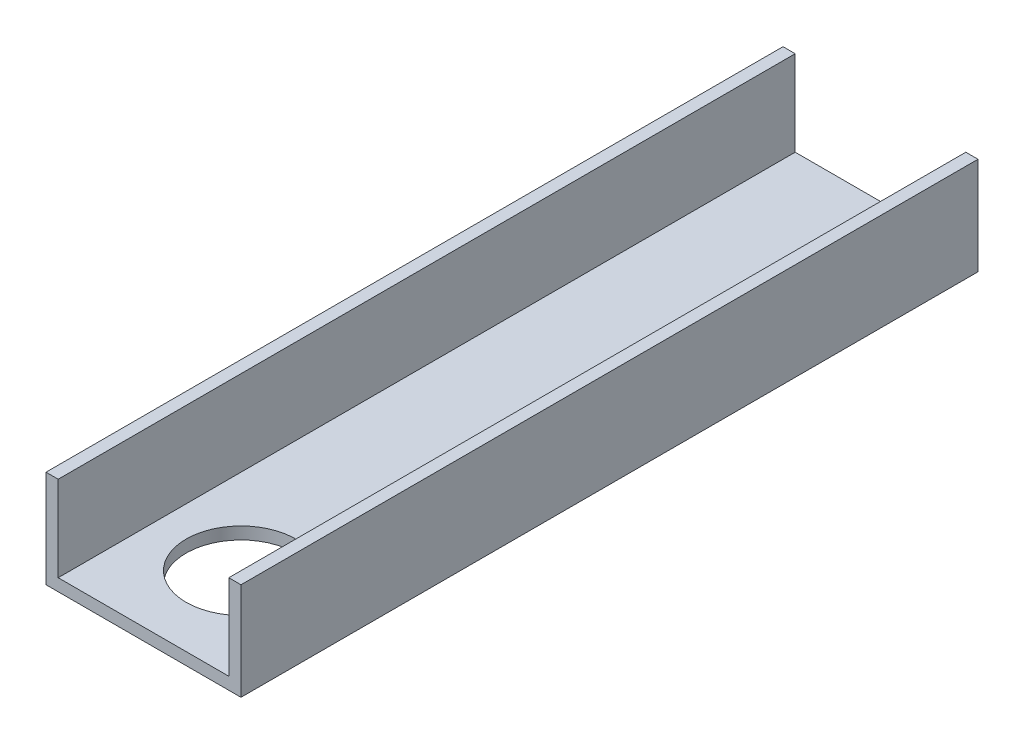
ISO-10303-21;
HEADER;
FILE_DESCRIPTION(('STEP AP214'),'2;1');
FILE_NAME('part.step','',(''),(''),'','','');
FILE_SCHEMA(('AUTOMOTIVE_DESIGN { 1 0 10303 214 1 1 1 1 }'));
ENDSEC;
DATA;
#1=APPLICATION_CONTEXT('core data for automotive mechanical design processes');
#2=APPLICATION_PROTOCOL_DEFINITION('international standard','automotive_design',2000,#1);
#3=PRODUCT_CONTEXT('',#1,'mechanical');
#4=PRODUCT('Part','Part','',(#3));
#5=PRODUCT_RELATED_PRODUCT_CATEGORY('part','',(#4));
#6=PRODUCT_DEFINITION_FORMATION('','',#4);
#7=PRODUCT_DEFINITION_CONTEXT('part definition',#1,'design');
#8=PRODUCT_DEFINITION('design','',#6,#7);
#9=PRODUCT_DEFINITION_SHAPE('','',#8);
#10=(LENGTH_UNIT() NAMED_UNIT(*) SI_UNIT(.MILLI.,.METRE.));
#11=(NAMED_UNIT(*) PLANE_ANGLE_UNIT() SI_UNIT($,.RADIAN.));
#12=(NAMED_UNIT(*) SI_UNIT($,.STERADIAN.) SOLID_ANGLE_UNIT());
#13=UNCERTAINTY_MEASURE_WITH_UNIT(LENGTH_MEASURE(1.E-05),#10,'distance_accuracy_value','');
#14=(GEOMETRIC_REPRESENTATION_CONTEXT(3) GLOBAL_UNCERTAINTY_ASSIGNED_CONTEXT((#13)) GLOBAL_UNIT_ASSIGNED_CONTEXT((#10,
#11,#12)) REPRESENTATION_CONTEXT('',''));
#15=CARTESIAN_POINT('',(0.,0.,0.));
#16=DIRECTION('',(0.,0.,1.));
#17=DIRECTION('',(1.,0.,0.));
#18=AXIS2_PLACEMENT_3D('',#15,#16,#17);
#19=CARTESIAN_POINT('',(0.,0.,192.024));
#20=DIRECTION('',(1.,0.,0.));
#21=DIRECTION('',(0.,0.,-1.));
#22=AXIS2_PLACEMENT_3D('',#19,#20,#21);
#23=PLANE('',#22);
#24=DIRECTION('',(0.,-1.,0.));
#25=VECTOR('',#24,1.);
#26=CARTESIAN_POINT('',(0.,0.,0.));
#27=LINE('',#26,#25);
#28=CARTESIAN_POINT('',(0.,25.4,0.));
#29=VERTEX_POINT('',#28);
#30=CARTESIAN_POINT('',(0.,0.,0.));
#31=VERTEX_POINT('',#30);
#32=EDGE_CURVE('E128',#29,#31,#27,.T.);
#33=ORIENTED_EDGE('',*,*,#32,.T.);
#34=DIRECTION('',(0.,0.,-1.));
#35=VECTOR('',#34,1.);
#36=CARTESIAN_POINT('',(0.,0.,192.024));
#37=LINE('',#36,#35);
#38=CARTESIAN_POINT('',(0.,0.,192.024));
#39=VERTEX_POINT('',#38);
#40=EDGE_CURVE('E11',#39,#31,#37,.T.);
#41=ORIENTED_EDGE('',*,*,#40,.F.);
#42=DIRECTION('',(0.,-1.,0.));
#43=VECTOR('',#42,1.);
#44=CARTESIAN_POINT('',(0.,0.,192.024));
#45=LINE('',#44,#43);
#46=CARTESIAN_POINT('',(0.,25.4,192.024));
#47=VERTEX_POINT('',#46);
#48=EDGE_CURVE('E143',#47,#39,#45,.T.);
#49=ORIENTED_EDGE('',*,*,#48,.F.);
#50=DIRECTION('',(0.,0.,-1.));
#51=VECTOR('',#50,1.);
#52=CARTESIAN_POINT('',(0.,25.4,192.024));
#53=LINE('',#52,#51);
#54=EDGE_CURVE('E124',#47,#29,#53,.T.);
#55=ORIENTED_EDGE('',*,*,#54,.T.);
#56=EDGE_LOOP('',(#33,#41,#49,#55));
#57=FACE_BOUND('',#56,.T.);
#58=ADVANCED_FACE('F32',(#57),#23,.F.);
#59=CARTESIAN_POINT('',(0.,0.,192.024));
#60=DIRECTION('',(0.,1.,0.));
#61=DIRECTION('',(0.,0.,1.));
#62=AXIS2_PLACEMENT_3D('',#59,#60,#61);
#63=PLANE('',#62);
#64=CARTESIAN_POINT('',(25.4,0.,166.624));
#65=DIRECTION('',(0.,1.,0.));
#66=DIRECTION('',(0.,0.,1.));
#67=AXIS2_PLACEMENT_3D('',#64,#65,#66);
#68=CIRCLE('',#67,14.2875);
#69=CARTESIAN_POINT('',(25.4,0.,180.9115));
#70=VERTEX_POINT('',#69);
#71=EDGE_CURVE('E132',#70,#70,#68,.F.);
#72=ORIENTED_EDGE('',*,*,#71,.F.);
#73=EDGE_LOOP('',(#72));
#74=FACE_BOUND('',#73,.T.);
#75=DIRECTION('',(1.,0.,0.));
#76=VECTOR('',#75,1.);
#77=CARTESIAN_POINT('',(0.,0.,0.));
#78=LINE('',#77,#76);
#79=CARTESIAN_POINT('',(50.8,0.,0.));
#80=VERTEX_POINT('',#79);
#81=EDGE_CURVE('E131',#31,#80,#78,.T.);
#82=ORIENTED_EDGE('',*,*,#81,.T.);
#83=DIRECTION('',(0.,0.,-1.));
#84=VECTOR('',#83,1.);
#85=CARTESIAN_POINT('',(50.8,0.,192.024));
#86=LINE('',#85,#84);
#87=CARTESIAN_POINT('',(50.8,0.,192.024));
#88=VERTEX_POINT('',#87);
#89=EDGE_CURVE('E40',#88,#80,#86,.T.);
#90=ORIENTED_EDGE('',*,*,#89,.F.);
#91=DIRECTION('',(1.,0.,0.));
#92=VECTOR('',#91,1.);
#93=CARTESIAN_POINT('',(0.,0.,192.024));
#94=LINE('',#93,#92);
#95=EDGE_CURVE('E91',#39,#88,#94,.T.);
#96=ORIENTED_EDGE('',*,*,#95,.F.);
#97=ORIENTED_EDGE('',*,*,#40,.T.);
#98=EDGE_LOOP('',(#82,#90,#96,#97));
#99=FACE_BOUND('',#98,.T.);
#100=ADVANCED_FACE('F195',(#74,#99),#63,.F.);
#101=CARTESIAN_POINT('',(50.8,0.,192.024));
#102=DIRECTION('',(-1.,0.,0.));
#103=DIRECTION('',(0.,0.,1.));
#104=AXIS2_PLACEMENT_3D('',#101,#102,#103);
#105=PLANE('',#104);
#106=DIRECTION('',(0.,1.,0.));
#107=VECTOR('',#106,1.);
#108=CARTESIAN_POINT('',(50.8,0.,0.));
#109=LINE('',#108,#107);
#110=CARTESIAN_POINT('',(50.8,25.4,0.));
#111=VERTEX_POINT('',#110);
#112=EDGE_CURVE('E134',#80,#111,#109,.T.);
#113=ORIENTED_EDGE('',*,*,#112,.T.);
#114=DIRECTION('',(0.,0.,-1.));
#115=VECTOR('',#114,1.);
#116=CARTESIAN_POINT('',(50.8,25.4,192.024));
#117=LINE('',#116,#115);
#118=CARTESIAN_POINT('',(50.8,25.4,192.024));
#119=VERTEX_POINT('',#118);
#120=EDGE_CURVE('E150',#119,#111,#117,.T.);
#121=ORIENTED_EDGE('',*,*,#120,.F.);
#122=DIRECTION('',(0.,1.,0.));
#123=VECTOR('',#122,1.);
#124=CARTESIAN_POINT('',(50.8,0.,192.024));
#125=LINE('',#124,#123);
#126=EDGE_CURVE('E158',#88,#119,#125,.T.);
#127=ORIENTED_EDGE('',*,*,#126,.F.);
#128=ORIENTED_EDGE('',*,*,#89,.T.);
#129=EDGE_LOOP('',(#113,#121,#127,#128));
#130=FACE_BOUND('',#129,.T.);
#131=ADVANCED_FACE('F156',(#130),#105,.F.);
#132=CARTESIAN_POINT('',(47.625,25.4,192.024));
#133=DIRECTION('',(0.,-1.,0.));
#134=DIRECTION('',(0.,0.,-1.));
#135=AXIS2_PLACEMENT_3D('',#132,#133,#134);
#136=PLANE('',#135);
#137=DIRECTION('',(-1.,0.,0.));
#138=VECTOR('',#137,1.);
#139=CARTESIAN_POINT('',(47.625,25.4,0.));
#140=LINE('',#139,#138);
#141=CARTESIAN_POINT('',(47.625,25.4,0.));
#142=VERTEX_POINT('',#141);
#143=EDGE_CURVE('E136',#111,#142,#140,.T.);
#144=ORIENTED_EDGE('',*,*,#143,.T.);
#145=DIRECTION('',(0.,0.,-1.));
#146=VECTOR('',#145,1.);
#147=CARTESIAN_POINT('',(47.625,25.4,192.024));
#148=LINE('',#147,#146);
#149=CARTESIAN_POINT('',(47.625,25.4,192.024));
#150=VERTEX_POINT('',#149);
#151=EDGE_CURVE('E147',#150,#142,#148,.T.);
#152=ORIENTED_EDGE('',*,*,#151,.F.);
#153=DIRECTION('',(-1.,0.,0.));
#154=VECTOR('',#153,1.);
#155=CARTESIAN_POINT('',(47.625,25.4,192.024));
#156=LINE('',#155,#154);
#157=EDGE_CURVE('E170',#119,#150,#156,.T.);
#158=ORIENTED_EDGE('',*,*,#157,.F.);
#159=ORIENTED_EDGE('',*,*,#120,.T.);
#160=EDGE_LOOP('',(#144,#152,#158,#159));
#161=FACE_BOUND('',#160,.T.);
#162=ADVANCED_FACE('F166',(#161),#136,.F.);
#163=CARTESIAN_POINT('',(47.625,3.175,192.024));
#164=DIRECTION('',(1.,0.,0.));
#165=DIRECTION('',(0.,0.,-1.));
#166=AXIS2_PLACEMENT_3D('',#163,#164,#165);
#167=PLANE('',#166);
#168=DIRECTION('',(0.,-1.,0.));
#169=VECTOR('',#168,1.);
#170=CARTESIAN_POINT('',(47.625,3.175,0.));
#171=LINE('',#170,#169);
#172=CARTESIAN_POINT('',(47.625,3.175,0.));
#173=VERTEX_POINT('',#172);
#174=EDGE_CURVE('E138',#142,#173,#171,.T.);
#175=ORIENTED_EDGE('',*,*,#174,.T.);
#176=DIRECTION('',(0.,0.,-1.));
#177=VECTOR('',#176,1.);
#178=CARTESIAN_POINT('',(47.625,3.175,192.024));
#179=LINE('',#178,#177);
#180=CARTESIAN_POINT('',(47.625,3.175,192.024));
#181=VERTEX_POINT('',#180);
#182=EDGE_CURVE('E119',#181,#173,#179,.T.);
#183=ORIENTED_EDGE('',*,*,#182,.F.);
#184=DIRECTION('',(0.,-1.,0.));
#185=VECTOR('',#184,1.);
#186=CARTESIAN_POINT('',(47.625,3.175,192.024));
#187=LINE('',#186,#185);
#188=EDGE_CURVE('E110',#150,#181,#187,.T.);
#189=ORIENTED_EDGE('',*,*,#188,.F.);
#190=ORIENTED_EDGE('',*,*,#151,.T.);
#191=EDGE_LOOP('',(#175,#183,#189,#190));
#192=FACE_BOUND('',#191,.T.);
#193=ADVANCED_FACE('F169',(#192),#167,.F.);
#194=CARTESIAN_POINT('',(3.175,3.175,192.024));
#195=DIRECTION('',(0.,-1.,0.));
#196=DIRECTION('',(0.,0.,-1.));
#197=AXIS2_PLACEMENT_3D('',#194,#195,#196);
#198=PLANE('',#197);
#199=CARTESIAN_POINT('',(25.4,3.175,166.624));
#200=DIRECTION('',(0.,1.,0.));
#201=DIRECTION('',(0.,0.,1.));
#202=AXIS2_PLACEMENT_3D('',#199,#200,#201);
#203=CIRCLE('',#202,14.2875);
#204=CARTESIAN_POINT('',(25.4,3.175,180.9115));
#205=VERTEX_POINT('',#204);
#206=EDGE_CURVE('E178',#205,#205,#203,.T.);
#207=ORIENTED_EDGE('',*,*,#206,.F.);
#208=EDGE_LOOP('',(#207));
#209=FACE_BOUND('',#208,.T.);
#210=DIRECTION('',(-1.,0.,0.));
#211=VECTOR('',#210,1.);
#212=CARTESIAN_POINT('',(3.175,3.175,0.));
#213=LINE('',#212,#211);
#214=CARTESIAN_POINT('',(3.175,3.175,0.));
#215=VERTEX_POINT('',#214);
#216=EDGE_CURVE('E118',#173,#215,#213,.T.);
#217=ORIENTED_EDGE('',*,*,#216,.T.);
#218=DIRECTION('',(0.,0.,-1.));
#219=VECTOR('',#218,1.);
#220=CARTESIAN_POINT('',(3.175,3.175,192.024));
#221=LINE('',#220,#219);
#222=CARTESIAN_POINT('',(3.175,3.175,192.024));
#223=VERTEX_POINT('',#222);
#224=EDGE_CURVE('E115',#223,#215,#221,.T.);
#225=ORIENTED_EDGE('',*,*,#224,.F.);
#226=DIRECTION('',(-1.,0.,0.));
#227=VECTOR('',#226,1.);
#228=CARTESIAN_POINT('',(3.175,3.175,192.024));
#229=LINE('',#228,#227);
#230=EDGE_CURVE('E104',#181,#223,#229,.T.);
#231=ORIENTED_EDGE('',*,*,#230,.F.);
#232=ORIENTED_EDGE('',*,*,#182,.T.);
#233=EDGE_LOOP('',(#217,#225,#231,#232));
#234=FACE_BOUND('',#233,.T.);
#235=ADVANCED_FACE('F116',(#209,#234),#198,.F.);
#236=CARTESIAN_POINT('',(3.175,3.175,192.024));
#237=DIRECTION('',(-1.,0.,0.));
#238=DIRECTION('',(0.,0.,1.));
#239=AXIS2_PLACEMENT_3D('',#236,#237,#238);
#240=PLANE('',#239);
#241=DIRECTION('',(0.,1.,0.));
#242=VECTOR('',#241,1.);
#243=CARTESIAN_POINT('',(3.175,3.175,0.));
#244=LINE('',#243,#242);
#245=CARTESIAN_POINT('',(3.175,25.4,0.));
#246=VERTEX_POINT('',#245);
#247=EDGE_CURVE('E77',#215,#246,#244,.T.);
#248=ORIENTED_EDGE('',*,*,#247,.T.);
#249=DIRECTION('',(0.,0.,-1.));
#250=VECTOR('',#249,1.);
#251=CARTESIAN_POINT('',(3.175,25.4,192.024));
#252=LINE('',#251,#250);
#253=CARTESIAN_POINT('',(3.175,25.4,192.024));
#254=VERTEX_POINT('',#253);
#255=EDGE_CURVE('E120',#254,#246,#252,.T.);
#256=ORIENTED_EDGE('',*,*,#255,.F.);
#257=DIRECTION('',(0.,1.,0.));
#258=VECTOR('',#257,1.);
#259=CARTESIAN_POINT('',(3.175,3.175,192.024));
#260=LINE('',#259,#258);
#261=EDGE_CURVE('E108',#223,#254,#260,.T.);
#262=ORIENTED_EDGE('',*,*,#261,.F.);
#263=ORIENTED_EDGE('',*,*,#224,.T.);
#264=EDGE_LOOP('',(#248,#256,#262,#263));
#265=FACE_BOUND('',#264,.T.);
#266=ADVANCED_FACE('F122',(#265),#240,.F.);
#267=CARTESIAN_POINT('',(0.,25.4,192.024));
#268=DIRECTION('',(0.,-1.,0.));
#269=DIRECTION('',(0.,0.,-1.));
#270=AXIS2_PLACEMENT_3D('',#267,#268,#269);
#271=PLANE('',#270);
#272=DIRECTION('',(-1.,0.,0.));
#273=VECTOR('',#272,1.);
#274=CARTESIAN_POINT('',(0.,25.4,0.));
#275=LINE('',#274,#273);
#276=EDGE_CURVE('E83',#246,#29,#275,.T.);
#277=ORIENTED_EDGE('',*,*,#276,.T.);
#278=ORIENTED_EDGE('',*,*,#54,.F.);
#279=DIRECTION('',(-1.,0.,0.));
#280=VECTOR('',#279,1.);
#281=CARTESIAN_POINT('',(0.,25.4,192.024));
#282=LINE('',#281,#280);
#283=EDGE_CURVE('E48',#254,#47,#282,.T.);
#284=ORIENTED_EDGE('',*,*,#283,.F.);
#285=ORIENTED_EDGE('',*,*,#255,.T.);
#286=EDGE_LOOP('',(#277,#278,#284,#285));
#287=FACE_BOUND('',#286,.T.);
#288=ADVANCED_FACE('F191',(#287),#271,.F.);
#289=CARTESIAN_POINT('',(0.,0.,192.024));
#290=DIRECTION('',(0.,0.,-1.));
#291=DIRECTION('',(-1.,0.,0.));
#292=AXIS2_PLACEMENT_3D('',#289,#290,#291);
#293=PLANE('',#292);
#294=ORIENTED_EDGE('',*,*,#48,.T.);
#295=ORIENTED_EDGE('',*,*,#95,.T.);
#296=ORIENTED_EDGE('',*,*,#126,.T.);
#297=ORIENTED_EDGE('',*,*,#157,.T.);
#298=ORIENTED_EDGE('',*,*,#188,.T.);
#299=ORIENTED_EDGE('',*,*,#230,.T.);
#300=ORIENTED_EDGE('',*,*,#261,.T.);
#301=ORIENTED_EDGE('',*,*,#283,.T.);
#302=EDGE_LOOP('',(#294,#295,#296,#297,#298,#299,#300,#301));
#303=FACE_BOUND('',#302,.T.);
#304=ADVANCED_FACE('F106',(#303),#293,.F.);
#305=CARTESIAN_POINT('',(0.,0.,0.));
#306=DIRECTION('',(0.,0.,-1.));
#307=DIRECTION('',(-1.,0.,0.));
#308=AXIS2_PLACEMENT_3D('',#305,#306,#307);
#309=PLANE('',#308);
#310=ORIENTED_EDGE('',*,*,#32,.F.);
#311=ORIENTED_EDGE('',*,*,#276,.F.);
#312=ORIENTED_EDGE('',*,*,#247,.F.);
#313=ORIENTED_EDGE('',*,*,#216,.F.);
#314=ORIENTED_EDGE('',*,*,#174,.F.);
#315=ORIENTED_EDGE('',*,*,#143,.F.);
#316=ORIENTED_EDGE('',*,*,#112,.F.);
#317=ORIENTED_EDGE('',*,*,#81,.F.);
#318=EDGE_LOOP('',(#310,#311,#312,#313,#314,#315,#316,#317));
#319=FACE_BOUND('',#318,.T.);
#320=ADVANCED_FACE('F162',(#319),#309,.T.);
#321=CARTESIAN_POINT('',(25.4,-0.00100000000000013,166.624));
#322=DIRECTION('',(0.,1.,0.));
#323=DIRECTION('',(0.,0.,1.));
#324=AXIS2_PLACEMENT_3D('',#321,#322,#323);
#325=CYLINDRICAL_SURFACE('',#324,14.2875);
#326=ORIENTED_EDGE('',*,*,#206,.T.);
#327=EDGE_LOOP('',(#326));
#328=FACE_BOUND('',#327,.T.);
#329=ORIENTED_EDGE('',*,*,#71,.T.);
#330=EDGE_LOOP('',(#329));
#331=FACE_BOUND('',#330,.T.);
#332=ADVANCED_FACE('F182',(#328,#331),#325,.F.);
#333=CLOSED_SHELL('',(#58,#100,#131,#162,#193,#235,#266,#288,#304,#320,#332));
#334=MANIFOLD_SOLID_BREP('B2',#333);
#335=ADVANCED_BREP_SHAPE_REPRESENTATION('',(#18,#334),#14);
#336=SHAPE_DEFINITION_REPRESENTATION(#9,#335);
ENDSEC;
END-ISO-10303-21;
